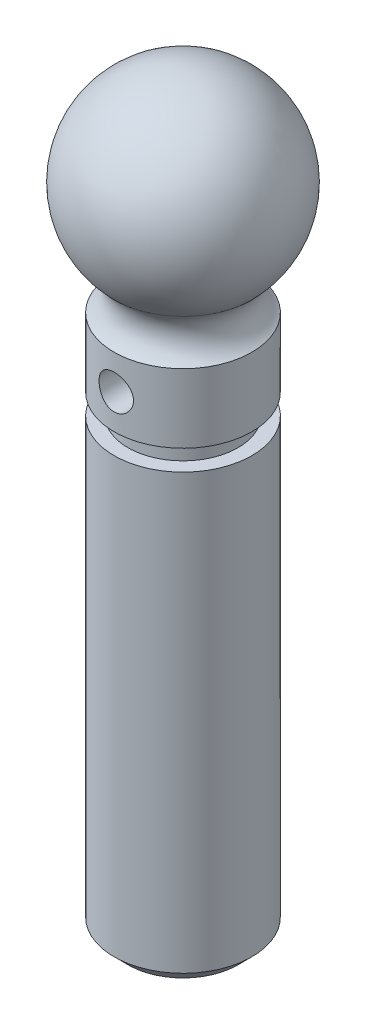
ISO-10303-21;
HEADER;
FILE_DESCRIPTION(('STEP AP214'),'2;1');
FILE_NAME('part.step','',(''),(''),'','','');
FILE_SCHEMA(('AUTOMOTIVE_DESIGN { 1 0 10303 214 1 1 1 1 }'));
ENDSEC;
DATA;
#1=APPLICATION_CONTEXT('core data for automotive mechanical design processes');
#2=APPLICATION_PROTOCOL_DEFINITION('international standard','automotive_design',2000,#1);
#3=PRODUCT_CONTEXT('',#1,'mechanical');
#4=PRODUCT('Part','Part','',(#3));
#5=PRODUCT_RELATED_PRODUCT_CATEGORY('part','',(#4));
#6=PRODUCT_DEFINITION_FORMATION('','',#4);
#7=PRODUCT_DEFINITION_CONTEXT('part definition',#1,'design');
#8=PRODUCT_DEFINITION('design','',#6,#7);
#9=PRODUCT_DEFINITION_SHAPE('','',#8);
#10=(LENGTH_UNIT() NAMED_UNIT(*) SI_UNIT(.MILLI.,.METRE.));
#11=(NAMED_UNIT(*) PLANE_ANGLE_UNIT() SI_UNIT($,.RADIAN.));
#12=(NAMED_UNIT(*) SI_UNIT($,.STERADIAN.) SOLID_ANGLE_UNIT());
#13=UNCERTAINTY_MEASURE_WITH_UNIT(LENGTH_MEASURE(1.E-05),#10,'distance_accuracy_value','');
#14=(GEOMETRIC_REPRESENTATION_CONTEXT(3) GLOBAL_UNCERTAINTY_ASSIGNED_CONTEXT((#13)) GLOBAL_UNIT_ASSIGNED_CONTEXT((#10,
#11,#12)) REPRESENTATION_CONTEXT('',''));
#15=CARTESIAN_POINT('',(0.,0.,0.));
#16=DIRECTION('',(0.,0.,1.));
#17=DIRECTION('',(1.,0.,0.));
#18=AXIS2_PLACEMENT_3D('',#15,#16,#17);
#19=CARTESIAN_POINT('',(0.,-152.629666453839,0.));
#20=DIRECTION('',(0.,-1.,0.));
#21=DIRECTION('',(0.,0.,-1.));
#22=AXIS2_PLACEMENT_3D('',#19,#20,#21);
#23=PLANE('',#22);
#24=CARTESIAN_POINT('',(0.,-152.629666453839,0.));
#25=DIRECTION('',(0.,-1.,0.));
#26=DIRECTION('',(0.,0.,-1.));
#27=AXIS2_PLACEMENT_3D('',#24,#25,#26);
#28=CIRCLE('',#27,80.);
#29=CARTESIAN_POINT('',(0.,-152.629666453839,-80.));
#30=VERTEX_POINT('',#29);
#31=EDGE_CURVE('E10',#30,#30,#28,.T.);
#32=ORIENTED_EDGE('',*,*,#31,.T.);
#33=EDGE_LOOP('',(#32));
#34=FACE_BOUND('',#33,.T.);
#35=ADVANCED_FACE('F39',(#34),#23,.T.);
#36=CARTESIAN_POINT('',(0.,-152.629666453839,0.));
#37=DIRECTION('',(0.,1.,0.));
#38=DIRECTION('',(0.,0.,1.));
#39=AXIS2_PLACEMENT_3D('',#36,#37,#38);
#40=CONICAL_SURFACE('',#39,80.,0.785398163397447);
#41=CARTESIAN_POINT('',(0.,-132.629666453839,0.));
#42=DIRECTION('',(0.,-1.,0.));
#43=DIRECTION('',(0.,0.,-1.));
#44=AXIS2_PLACEMENT_3D('',#41,#42,#43);
#45=CIRCLE('',#44,100.);
#46=CARTESIAN_POINT('',(0.,-132.629666453839,-100.));
#47=VERTEX_POINT('',#46);
#48=EDGE_CURVE('E52',#47,#47,#45,.T.);
#49=ORIENTED_EDGE('',*,*,#48,.T.);
#50=EDGE_LOOP('',(#49));
#51=FACE_BOUND('',#50,.T.);
#52=ORIENTED_EDGE('',*,*,#31,.F.);
#53=EDGE_LOOP('',(#52));
#54=FACE_BOUND('',#53,.T.);
#55=ADVANCED_FACE('F91',(#51,#54),#40,.T.);
#56=CARTESIAN_POINT('',(0.,-208.82897467915,0.));
#57=DIRECTION('',(0.,-1.,0.));
#58=DIRECTION('',(0.,0.,-1.));
#59=AXIS2_PLACEMENT_3D('',#56,#57,#58);
#60=CYLINDRICAL_SURFACE('',#59,100.);
#61=CARTESIAN_POINT('',(0.,497.370333546161,0.));
#62=DIRECTION('',(0.,-1.,0.));
#63=DIRECTION('',(0.,0.,-1.));
#64=AXIS2_PLACEMENT_3D('',#61,#62,#63);
#65=CIRCLE('',#64,100.);
#66=CARTESIAN_POINT('',(0.,497.370333546161,-100.));
#67=VERTEX_POINT('',#66);
#68=EDGE_CURVE('E58',#67,#67,#65,.T.);
#69=ORIENTED_EDGE('',*,*,#68,.T.);
#70=EDGE_LOOP('',(#69));
#71=FACE_BOUND('',#70,.T.);
#72=ORIENTED_EDGE('',*,*,#48,.F.);
#73=EDGE_LOOP('',(#72));
#74=FACE_BOUND('',#73,.T.);
#75=ADVANCED_FACE('F95',(#71,#74),#60,.T.);
#76=CARTESIAN_POINT('',(0.,497.370333546161,0.));
#77=DIRECTION('',(0.,1.,0.));
#78=DIRECTION('',(0.,0.,1.));
#79=AXIS2_PLACEMENT_3D('',#76,#77,#78);
#80=PLANE('',#79);
#81=CARTESIAN_POINT('',(0.,497.370333546161,0.));
#82=DIRECTION('',(0.,-1.,0.));
#83=DIRECTION('',(0.,0.,-1.));
#84=AXIS2_PLACEMENT_3D('',#81,#82,#83);
#85=CIRCLE('',#84,80.);
#86=CARTESIAN_POINT('',(0.,497.370333546161,-80.));
#87=VERTEX_POINT('',#86);
#88=EDGE_CURVE('E128',#87,#87,#85,.T.);
#89=ORIENTED_EDGE('',*,*,#88,.T.);
#90=EDGE_LOOP('',(#89));
#91=FACE_BOUND('',#90,.T.);
#92=ORIENTED_EDGE('',*,*,#68,.F.);
#93=EDGE_LOOP('',(#92));
#94=FACE_BOUND('',#93,.T.);
#95=ADVANCED_FACE('F100',(#91,#94),#80,.T.);
#96=CARTESIAN_POINT('',(0.,-208.82897467915,0.));
#97=DIRECTION('',(0.,-1.,0.));
#98=DIRECTION('',(0.,0.,-1.));
#99=AXIS2_PLACEMENT_3D('',#96,#97,#98);
#100=CYLINDRICAL_SURFACE('',#99,80.);
#101=CARTESIAN_POINT('',(0.,527.370333546161,0.));
#102=DIRECTION('',(0.,-1.,0.));
#103=DIRECTION('',(0.,0.,-1.));
#104=AXIS2_PLACEMENT_3D('',#101,#102,#103);
#105=CIRCLE('',#104,80.);
#106=CARTESIAN_POINT('',(0.,527.370333546161,-80.));
#107=VERTEX_POINT('',#106);
#108=EDGE_CURVE('E118',#107,#107,#105,.T.);
#109=ORIENTED_EDGE('',*,*,#108,.T.);
#110=EDGE_LOOP('',(#109));
#111=FACE_BOUND('',#110,.T.);
#112=ORIENTED_EDGE('',*,*,#88,.F.);
#113=EDGE_LOOP('',(#112));
#114=FACE_BOUND('',#113,.T.);
#115=ADVANCED_FACE('F107',(#111,#114),#100,.T.);
#116=CARTESIAN_POINT('',(0.,527.370333546161,0.));
#117=DIRECTION('',(0.,1.,0.));
#118=DIRECTION('',(0.,0.,1.));
#119=AXIS2_PLACEMENT_3D('',#116,#117,#118);
#120=PLANE('',#119);
#121=ORIENTED_EDGE('',*,*,#108,.F.);
#122=EDGE_LOOP('',(#121));
#123=FACE_BOUND('',#122,.T.);
#124=CARTESIAN_POINT('',(0.,527.370333546161,0.));
#125=DIRECTION('',(0.,-1.,0.));
#126=DIRECTION('',(0.,0.,-1.));
#127=AXIS2_PLACEMENT_3D('',#124,#125,#126);
#128=CIRCLE('',#127,100.);
#129=CARTESIAN_POINT('',(0.,527.370333546161,-100.));
#130=VERTEX_POINT('',#129);
#131=EDGE_CURVE('E121',#130,#130,#128,.T.);
#132=ORIENTED_EDGE('',*,*,#131,.T.);
#133=EDGE_LOOP('',(#132));
#134=FACE_BOUND('',#133,.T.);
#135=ADVANCED_FACE('F86',(#123,#134),#120,.F.);
#136=CARTESIAN_POINT('',(0.,-208.82897467915,0.));
#137=DIRECTION('',(0.,-1.,0.));
#138=DIRECTION('',(0.,0.,-1.));
#139=AXIS2_PLACEMENT_3D('',#136,#137,#138);
#140=CYLINDRICAL_SURFACE('',#139,100.);
#141=CARTESIAN_POINT('',(0.,602.370333546161,-100.));
#142=CARTESIAN_POINT('',(0.690691718577893,602.37033063179,-99.9999983687946));
#143=CARTESIAN_POINT('',(1.38144196188158,602.341686088876,-99.9928263562298));
#144=CARTESIAN_POINT('',(2.75795370811009,602.227340433713,-99.9643325641892));
#145=CARTESIAN_POINT('',(3.44371463282091,602.141632811618,-99.9430091703019));
#146=CARTESIAN_POINT('',(4.80560043844885,601.913827202951,-99.8867904125939));
#147=CARTESIAN_POINT('',(5.48172025067541,601.771700610666,-99.8518881641608));
#148=CARTESIAN_POINT('',(6.81913918226601,601.432239763702,-99.7694755652982));
#149=CARTESIAN_POINT('',(7.4804386800074,601.234906920232,-99.7219655371565));
#150=CARTESIAN_POINT('',(8.7828632093722,600.78688761564,-99.6157002768425));
#151=CARTESIAN_POINT('',(9.42401178688588,600.536266299872,-99.5569587839334));
#152=CARTESIAN_POINT('',(10.6826681805201,599.983450811957,-99.4297780119914));
#153=CARTESIAN_POINT('',(11.3001758714244,599.681256366693,-99.361338681602));
#154=CARTESIAN_POINT('',(12.50751204788,599.027512753588,-99.2165905956057));
#155=CARTESIAN_POINT('',(13.0973405154809,598.675963553741,-99.1402818348955));
#156=CARTESIAN_POINT('',(14.2455581957605,597.92597310924,-98.9818166046016));
#157=CARTESIAN_POINT('',(14.8039469737492,597.527531216477,-98.899660054201));
#158=CARTESIAN_POINT('',(15.8957836878018,596.678648637567,-98.7301115930059));
#159=CARTESIAN_POINT('',(16.4285793662583,596.227382550093,-98.642650958478));
#160=CARTESIAN_POINT('',(17.4544579588291,595.282018292891,-98.4663031294358));
#161=CARTESIAN_POINT('',(17.9475404035237,594.787919617014,-98.377415918074));
#162=CARTESIAN_POINT('',(18.8908144242953,593.76007824223,-98.2006490181519));
#163=CARTESIAN_POINT('',(19.3410013589341,593.226331264338,-98.1127694395238));
#164=CARTESIAN_POINT('',(20.1954102433873,592.122703272391,-97.9404686301785));
#165=CARTESIAN_POINT('',(20.5996319325418,591.552822053455,-97.8560474190748));
#166=CARTESIAN_POINT('',(21.3649693563398,590.371890841129,-97.6918297726577));
#167=CARTESIAN_POINT('',(21.7253533764776,589.760354086315,-97.6121209493078));
#168=CARTESIAN_POINT('',(22.3931998389296,588.508025648318,-97.4610788045016));
#169=CARTESIAN_POINT('',(22.7006616131715,587.867233595956,-97.3897455887797));
#170=CARTESIAN_POINT('',(23.2602118051115,586.56094513801,-97.2576230412988));
#171=CARTESIAN_POINT('',(23.5123071109714,585.895451817577,-97.1968323981329));
#172=CARTESIAN_POINT('',(23.9590871683512,584.5444740209,-97.0876670484091));
#173=CARTESIAN_POINT('',(24.1537732950483,583.858990023944,-97.0392920444512));
#174=CARTESIAN_POINT('',(24.480750686621,582.486989655108,-96.9573138223671));
#175=CARTESIAN_POINT('',(24.6142135564042,581.800768949308,-96.9234341466123));
#176=CARTESIAN_POINT('',(24.8232510194518,580.419008806161,-96.870108305993));
#177=CARTESIAN_POINT('',(24.8988263145035,579.723469481889,-96.8506619661492));
#178=CARTESIAN_POINT('',(24.9914162325889,578.328345236368,-96.8268114234769));
#179=CARTESIAN_POINT('',(25.0084391701139,577.628760903648,-96.8224050849543));
#180=CARTESIAN_POINT('',(24.9837950102734,576.230701528122,-96.8287671854087));
#181=CARTESIAN_POINT('',(24.9421287289765,575.532226470027,-96.8395354133845));
#182=CARTESIAN_POINT('',(24.802202268535,574.158507963292,-96.8754653985753));
#183=CARTESIAN_POINT('',(24.7053405668353,573.483112181275,-96.9002713800197));
#184=CARTESIAN_POINT('',(24.4569100969496,572.143109800594,-96.9632711174988));
#185=CARTESIAN_POINT('',(24.3053423464993,571.478503001456,-97.0014646244755));
#186=CARTESIAN_POINT('',(23.9487164736509,570.164614419876,-97.0901266600956));
#187=CARTESIAN_POINT('',(23.7436557403212,569.515333387155,-97.1405957878898));
#188=CARTESIAN_POINT('',(23.2816402498254,568.236468615357,-97.2523607127204));
#189=CARTESIAN_POINT('',(23.0246846753548,567.606885186684,-97.3136566802694));
#190=CARTESIAN_POINT('',(22.4579463407742,566.365288394409,-97.4460164642436));
#191=CARTESIAN_POINT('',(22.1476574104599,565.753515967376,-97.5171724732175));
#192=CARTESIAN_POINT('',(21.4783236807046,564.558197528169,-97.6667760825988));
#193=CARTESIAN_POINT('',(21.1192787012251,563.974651620236,-97.7452237099312));
#194=CARTESIAN_POINT('',(20.3548482641723,562.839383156844,-97.9072661620095));
#195=CARTESIAN_POINT('',(19.9494560332643,562.287665270605,-97.9908617382673));
#196=CARTESIAN_POINT('',(19.0950487034994,561.219579821211,-98.1609331805174));
#197=CARTESIAN_POINT('',(18.6460327697884,560.703212934912,-98.2474091016118));
#198=CARTESIAN_POINT('',(17.6938422098701,559.694858653353,-98.4234165639801));
#199=CARTESIAN_POINT('',(17.1894875790101,559.20398774641,-98.5129648717742));
#200=CARTESIAN_POINT('',(16.1410084351566,558.266342139896,-98.6901741383605));
#201=CARTESIAN_POINT('',(15.5968831454468,557.819568301935,-98.7778350602491));
#202=CARTESIAN_POINT('',(14.472432124181,556.973179204776,-98.9488355726236));
#203=CARTESIAN_POINT('',(13.8921049769188,556.573565791598,-99.0321749938797));
#204=CARTESIAN_POINT('',(12.6991288854059,555.824377230592,-99.1922086769535));
#205=CARTESIAN_POINT('',(12.0864801382907,555.474801777623,-99.2689029792935));
#206=CARTESIAN_POINT('',(10.8308247011352,554.8271755865,-99.4137513798676));
#207=CARTESIAN_POINT('',(10.1877201028004,554.529307730678,-99.4818749399064));
#208=CARTESIAN_POINT('',(8.87762384412271,553.988933417246,-99.607332854455));
#209=CARTESIAN_POINT('',(8.21063204960423,553.746427270662,-99.6646671483496));
#210=CARTESIAN_POINT('',(6.8576710589653,553.318813851282,-99.7668906400155));
#211=CARTESIAN_POINT('',(6.17170483459301,553.133697644978,-99.8117817746149));
#212=CARTESIAN_POINT('',(4.78578117187119,552.822407335752,-99.8878263883026));
#213=CARTESIAN_POINT('',(4.08582407890433,552.696231779672,-99.9189802060777));
#214=CARTESIAN_POINT('',(2.69526184748653,552.506397364823,-99.966029730172));
#215=CARTESIAN_POINT('',(2.00487612348988,552.441220556101,-99.9822956790733));
#216=CARTESIAN_POINT('',(0.62089245558632,552.36844074453,-100.000466926533));
#217=CARTESIAN_POINT('',(-0.0727054333184448,552.360836759479,-100.002372470084));
#218=CARTESIAN_POINT('',(-1.45796442161552,552.403265326862,-99.9917700686444));
#219=CARTESIAN_POINT('',(-2.14962567682487,552.453293100525,-99.9792633187093));
#220=CARTESIAN_POINT('',(-3.52600893426171,552.610546680047,-99.940188390627));
#221=CARTESIAN_POINT('',(-4.21073096361024,552.717772262267,-99.9136202674584));
#222=CARTESIAN_POINT('',(-5.55819500352659,552.986498241231,-99.8476577254419));
#223=CARTESIAN_POINT('',(-6.22111242833486,553.147168746012,-99.808459698821));
#224=CARTESIAN_POINT('',(-7.53085245831729,553.521849094841,-99.7181888014641));
#225=CARTESIAN_POINT('',(-8.17767527117616,553.735858250214,-99.6671160840471));
#226=CARTESIAN_POINT('',(-9.45094991369454,554.215583863445,-99.5544479454933));
#227=CARTESIAN_POINT('',(-10.0774002380307,554.481304132151,-99.49285174887));
#228=CARTESIAN_POINT('',(-11.3058115834774,555.062479746863,-99.3607583571575));
#229=CARTESIAN_POINT('',(-11.9077721522074,555.37793601108,-99.2902609977426));
#230=CARTESIAN_POINT('',(-13.0938146627452,556.06237540728,-99.1408876869046));
#231=CARTESIAN_POINT('',(-13.6773900720096,556.432208747556,-99.0618852966785));
#232=CARTESIAN_POINT('',(-14.8114641777587,557.218493833515,-98.8986794214972));
#233=CARTESIAN_POINT('',(-15.3619625531209,557.634946031676,-98.8144758860636));
#234=CARTESIAN_POINT('',(-16.4264679436742,558.511735952044,-98.6431035755755));
#235=CARTESIAN_POINT('',(-16.9404694556796,558.972080268119,-98.5559343562586));
#236=CARTESIAN_POINT('',(-17.9286314107784,559.933606640516,-98.3809738269668));
#237=CARTESIAN_POINT('',(-18.4027912765831,560.434789288362,-98.2931825079978));
#238=CARTESIAN_POINT('',(-19.3193533877432,561.487588879246,-98.1172040120614));
#239=CARTESIAN_POINT('',(-19.7606886014806,562.040142672565,-98.0290601430093));
#240=CARTESIAN_POINT('',(-20.5952724266509,563.181100145286,-97.8571221402337));
#241=CARTESIAN_POINT('',(-20.9885201605534,563.769504478618,-97.7733280859044));
#242=CARTESIAN_POINT('',(-21.7240809911119,564.978207743975,-97.6125304168433));
#243=CARTESIAN_POINT('',(-22.0663952807536,565.598505928511,-97.5355266430837));
#244=CARTESIAN_POINT('',(-22.6975093780628,566.866774754211,-97.3905948483771));
#245=CARTESIAN_POINT('',(-22.9863099302,567.514745010253,-97.3226667011759));
#246=CARTESIAN_POINT('',(-23.5065409880998,568.82986729559,-97.1983214090437));
#247=CARTESIAN_POINT('',(-23.7383053115312,569.496880910212,-97.1418376446611));
#248=CARTESIAN_POINT('',(-24.144787808294,570.849016532051,-97.041604989601));
#249=CARTESIAN_POINT('',(-24.319506061575,571.534138513887,-96.9978560810756));
#250=CARTESIAN_POINT('',(-24.610365149996,572.917325342148,-96.9244678097152));
#251=CARTESIAN_POINT('',(-24.7265167337435,573.615387789239,-96.8948258579186));
#252=CARTESIAN_POINT('',(-24.899254408564,575.01931185043,-96.8505814129701));
#253=CARTESIAN_POINT('',(-24.9558419327214,575.725173276477,-96.8359785579845));
#254=CARTESIAN_POINT('',(-25.0081805511487,577.118952419221,-96.8224745496354));
#255=CARTESIAN_POINT('',(-25.0056340517487,577.806802527029,-96.8231340084288));
#256=CARTESIAN_POINT('',(-24.9438993060863,579.179775813599,-96.8390567190163));
#257=CARTESIAN_POINT('',(-24.8847122059515,579.864899047259,-96.8543196753074));
#258=CARTESIAN_POINT('',(-24.7102062085561,581.227466043072,-96.8989875673301));
#259=CARTESIAN_POINT('',(-24.5948888038426,581.904910008934,-96.9283921270255));
#260=CARTESIAN_POINT('',(-24.3090887740212,583.247336073335,-97.0004633253883));
#261=CARTESIAN_POINT('',(-24.138605872371,583.912318109385,-97.0431300305382));
#262=CARTESIAN_POINT('',(-23.7450417831308,585.221274461342,-97.1401758671174));
#263=CARTESIAN_POINT('',(-23.5222816522771,585.865350724285,-97.1944833379541));
#264=CARTESIAN_POINT('',(-23.0253369606671,587.132347930254,-97.3134064801047));
#265=CARTESIAN_POINT('',(-22.7511527683428,587.755269024811,-97.3780220775648));
#266=CARTESIAN_POINT('',(-22.1533369241106,588.976005277578,-97.5157613159781));
#267=CARTESIAN_POINT('',(-21.829700000846,589.573817750692,-97.5888858637346));
#268=CARTESIAN_POINT('',(-21.1352574183011,590.740516148953,-97.7416351358587));
#269=CARTESIAN_POINT('',(-20.7644507533768,591.309401457019,-97.821259998798));
#270=CARTESIAN_POINT('',(-19.9678759257203,592.42915996954,-97.9870076257221));
#271=CARTESIAN_POINT('',(-19.5409260434664,592.979175766693,-98.0732457319405));
#272=CARTESIAN_POINT('',(-18.642849663515,594.041504844209,-98.2479178566054));
#273=CARTESIAN_POINT('',(-18.1717223773881,594.553817451396,-98.336351914222));
#274=CARTESIAN_POINT('',(-17.1882735265502,595.537531242494,-98.5130084852273));
#275=CARTESIAN_POINT('',(-16.6759425070319,596.008922984609,-98.6012309452514));
#276=CARTESIAN_POINT('',(-15.6134987319544,596.907547759686,-98.7750391189996));
#277=CARTESIAN_POINT('',(-15.0633860059623,597.334780827205,-98.860624834787));
#278=CARTESIAN_POINT('',(-13.9186287608454,598.149511272594,-99.0283413187066));
#279=CARTESIAN_POINT('',(-13.323357520361,598.536147407116,-99.110381268769));
#280=CARTESIAN_POINT('',(-12.1013263586289,599.257805850757,-99.2670001275186));
#281=CARTESIAN_POINT('',(-11.4745649569063,599.592825730178,-99.3415786849227));
#282=CARTESIAN_POINT('',(-10.1943329896488,600.208454562156,-99.481103275592));
#283=CARTESIAN_POINT('',(-9.54087977494462,600.489098200962,-99.5460554432101));
#284=CARTESIAN_POINT('',(-8.21157839812749,600.993950397421,-99.6645121200838));
#285=CARTESIAN_POINT('',(-7.53573363177976,601.218167468449,-99.7180183560647));
#286=CARTESIAN_POINT('',(-6.29582951428942,601.571493718252,-99.8031697372876));
#287=CARTESIAN_POINT('',(-5.73473732965821,601.710565596903,-99.8370347879853));
#288=CARTESIAN_POINT('',(-4.60363901814699,601.949606546901,-99.8955814129244));
#289=CARTESIAN_POINT('',(-4.03363073252669,602.049565991151,-99.9202607261246));
#290=CARTESIAN_POINT('',(-2.88775475124441,602.209728131675,-99.9599394513684));
#291=CARTESIAN_POINT('',(-2.31188740827094,602.269933206771,-99.9749394426022));
#292=CARTESIAN_POINT('',(-1.15735989370907,602.350231909854,-99.9949691015044));
#293=CARTESIAN_POINT('',(-0.578700489132101,602.370335987986,-100.000001366716));
#294=CARTESIAN_POINT('',(0.,602.370333546161,-100.));
#295=B_SPLINE_CURVE_WITH_KNOTS('',3,(#141,#142,#143,#144,#145,#146,#147,#148,#149,#150,#151,
#152,#153,#154,#155,#156,#157,#158,#159,#160,#161,#162,#163,#164,#165,#166,#167,#168,#169,#170,
#171,#172,#173,#174,#175,#176,#177,#178,#179,#180,#181,#182,#183,#184,#185,#186,#187,#188,#189,
#190,#191,#192,#193,#194,#195,#196,#197,#198,#199,#200,#201,#202,#203,#204,#205,#206,#207,#208,
#209,#210,#211,#212,#213,#214,#215,#216,#217,#218,#219,#220,#221,#222,#223,#224,#225,#226,#227,
#228,#229,#230,#231,#232,#233,#234,#235,#236,#237,#238,#239,#240,#241,#242,#243,#244,#245,#246,
#247,#248,#249,#250,#251,#252,#253,#254,#255,#256,#257,#258,#259,#260,#261,#262,#263,#264,#265,
#266,#267,#268,#269,#270,#271,#272,#273,#274,#275,#276,#277,#278,#279,#280,#281,#282,#283,#284,
#285,#286,#287,#288,#289,#290,#291,#292,#293,#294),.UNSPECIFIED.,.T.,.F.,(4,2,2,2,2,2,2,2,2,2,2,
2,2,2,2,2,2,2,2,2,2,2,2,2,2,2,2,2,2,2,2,2,2,2,2,2,2,2,2,2,2,2,2,2,2,2,2,2,2,2,2,2,2,2,2,2,2,2,2,
2,2,2,2,2,2,2,2,2,2,2,2,2,2,2,2,2,4),(0.,2.07154772336505,4.1433318127346,6.21616768871231,
8.28895058270257,10.3592139133876,12.4294882079173,14.4997638450398,16.5700680990886,
18.6786613346413,20.7872794905936,22.8961255476291,25.0049835629279,27.1452518816709,
29.285547216444,31.4255761252987,33.5655537678246,35.6626698502671,37.7597605083855,
39.8565533653114,41.9533170667974,43.9991779786941,46.0450008319382,48.0909235581542,
50.13687850862,52.2034472600842,54.2700236428498,56.3369024286599,58.4038207774139,
60.5297328328953,62.6556864182894,64.7817231931958,66.9077470025134,69.0411434788409,
71.1745519404422,73.307628141698,75.4406517500885,77.5190618523894,79.5974364965344,
81.6756388161733,83.7538330102977,85.8011564249123,87.8484534071704,89.8959013220849,
91.9433870407815,94.0271911971411,96.1110155804636,98.1951535092679,100.279321631147,
102.414716830645,104.55015099236,106.685535129119,108.820889556721,110.943432087103,
113.065971642744,115.188121511612,117.310220321346,119.371303922137,121.432345817604,
123.493332911411,125.554330337018,127.602987062988,129.65162911175,131.700489685677,
133.749393947989,135.851764348232,137.954172276399,140.057064017271,142.159954112486,
144.300985029711,146.442116699489,148.581878025975,150.721316321548,152.457105282708,
154.193321220934,155.92943325805,157.665092812852),.UNSPECIFIED.);
#296=CARTESIAN_POINT('',(0.,602.370333546161,-100.));
#297=VERTEX_POINT('',#296);
#298=EDGE_CURVE('E42',#297,#297,#295,.T.);
#299=ORIENTED_EDGE('',*,*,#298,.F.);
#300=EDGE_LOOP('',(#299));
#301=FACE_BOUND('',#300,.T.);
#302=CARTESIAN_POINT('',(25.,577.370333546161,96.8245836551854));
#303=CARTESIAN_POINT('',(24.9999970616273,578.060645375375,96.8245854745999));
#304=CARTESIAN_POINT('',(24.9713837698994,578.751015917047,96.831986152206));
#305=CARTESIAN_POINT('',(24.8571657894974,580.126757510841,96.8613685320391));
#306=CARTESIAN_POINT('',(24.7715545662873,580.812127980619,96.8833519061003));
#307=CARTESIAN_POINT('',(24.5440123562521,582.173225838014,96.9412462724951));
#308=CARTESIAN_POINT('',(24.4020520792349,582.848948020918,96.9771645079383));
#309=CARTESIAN_POINT('',(24.0630015582853,584.185562079653,97.0618485176007));
#310=CARTESIAN_POINT('',(23.8659126950349,584.846454326449,97.1106139700627));
#311=CARTESIAN_POINT('',(23.4184823404702,586.148011918968,97.2194814509941));
#312=CARTESIAN_POINT('',(23.1682108291988,586.788702586794,97.2795685702615));
#313=CARTESIAN_POINT('',(22.6161798465929,588.046480435171,97.4093873837344));
#314=CARTESIAN_POINT('',(22.3144201031168,588.663567490945,97.4791191289162));
#315=CARTESIAN_POINT('',(21.6616135647911,589.870133515559,97.6262587137456));
#316=CARTESIAN_POINT('',(21.3105663561337,590.459612252549,97.7036666178391));
#317=CARTESIAN_POINT('',(20.561627092671,591.607222075345,97.8640183809547));
#318=CARTESIAN_POINT('',(20.1637343546382,592.165352703773,97.9469623207107));
#319=CARTESIAN_POINT('',(19.3154119355407,593.257511058082,98.1178154392342));
#320=CARTESIAN_POINT('',(18.8640961645914,593.790840412407,98.2057904966847));
#321=CARTESIAN_POINT('',(17.9185192820412,594.817793859914,98.382711712644));
#322=CARTESIAN_POINT('',(17.4242576343117,595.311417457267,98.471657883264));
#323=CARTESIAN_POINT('',(16.395981422222,596.255754087168,98.6480809319905));
#324=CARTESIAN_POINT('',(15.8619632635796,596.706463231517,98.7355576763718));
#325=CARTESIAN_POINT('',(14.7576838665687,597.561880362532,98.9066372356113));
#326=CARTESIAN_POINT('',(14.1874224684111,597.966588146365,98.9902400333874));
#327=CARTESIAN_POINT('',(13.0061645521339,598.732497886072,99.1524078021352));
#328=CARTESIAN_POINT('',(12.3947097272979,599.093011910717,99.2308859210377));
#329=CARTESIAN_POINT('',(11.1425307592606,599.761126029837,99.3792807630436));
#330=CARTESIAN_POINT('',(10.501806260338,600.068725481013,99.4491973820591));
#331=CARTESIAN_POINT('',(9.19565301719842,600.628552648606,99.5784642595474));
#332=CARTESIAN_POINT('',(8.5302270988342,600.880786676167,99.6378157222039));
#333=CARTESIAN_POINT('',(7.17940674093004,601.32784229174,99.7442481767985));
#334=CARTESIAN_POINT('',(6.49401276552392,601.522665213037,99.7913294536898));
#335=CARTESIAN_POINT('',(5.12237712983338,601.849881274347,99.8710347595305));
#336=CARTESIAN_POINT('',(4.43643387778207,601.983459086697,99.9039323240598));
#337=CARTESIAN_POINT('',(3.0552523601549,602.192768458733,99.9557050150334));
#338=CARTESIAN_POINT('',(2.36001420820846,602.26850072492,99.9745803127394));
#339=CARTESIAN_POINT('',(0.96548473066567,602.361454364079,99.9977704181674));
#340=CARTESIAN_POINT('',(0.266193938380401,602.378683268249,100.002087100034));
#341=CARTESIAN_POINT('',(-1.13130441985491,602.354499102414,99.9960418508521));
#342=CARTESIAN_POINT('',(-1.82951199914959,602.313086760675,99.9856801020947));
#343=CARTESIAN_POINT('',(-3.20417981210038,602.173556917598,99.9509653190368));
#344=CARTESIAN_POINT('',(-3.88077850177767,602.076720135672,99.9269283571732));
#345=CARTESIAN_POINT('',(-5.22319547538982,601.828137764832,99.8657583403713));
#346=CARTESIAN_POINT('',(-5.8890139460594,601.676393128097,99.8286255125337));
#347=CARTESIAN_POINT('',(-7.20529930600362,601.31921112578,99.742261544355));
#348=CARTESIAN_POINT('',(-7.85576568726136,601.113771986099,99.6930300042683));
#349=CARTESIAN_POINT('',(-9.136950549492,600.650799611248,99.583781478904));
#350=CARTESIAN_POINT('',(-9.7676687496275,600.393265635628,99.523764340327));
#351=CARTESIAN_POINT('',(-11.0108010674711,599.825475621687,99.3939453393901));
#352=CARTESIAN_POINT('',(-11.6229988555184,599.514765127021,99.3240601278314));
#353=CARTESIAN_POINT('',(-12.8190987470094,598.84452029267,99.1767808396332));
#354=CARTESIAN_POINT('',(-13.4030007587637,598.48498579479,99.0993867386643));
#355=CARTESIAN_POINT('',(-14.538887342836,597.719531689566,98.9391218641554));
#356=CARTESIAN_POINT('',(-15.0908672647017,597.313605349305,98.8562502964002));
#357=CARTESIAN_POINT('',(-16.1593684028108,596.458110546832,98.6872202885033));
#358=CARTESIAN_POINT('',(-16.6758889563233,596.008541269319,98.6010617869759));
#359=CARTESIAN_POINT('',(-17.6837185262898,595.055915768402,98.4253769536768));
#360=CARTESIAN_POINT('',(-18.1739655712883,594.551740544896,98.3358226147209));
#361=CARTESIAN_POINT('',(-19.110382278399,593.50374915575,98.1581401562259));
#362=CARTESIAN_POINT('',(-19.5565511163678,592.959932249249,98.0700120633793));
#363=CARTESIAN_POINT('',(-20.4017835894276,591.836208346914,97.8976676394506));
#364=CARTESIAN_POINT('',(-20.8008446790282,591.256299403413,97.8134515199027));
#365=CARTESIAN_POINT('',(-21.5490032693976,590.064254422025,97.6513544650869));
#366=CARTESIAN_POINT('',(-21.8981010019707,589.452118533673,97.5734735004277));
#367=CARTESIAN_POINT('',(-22.5453252558234,588.196666642154,97.4259671802193));
#368=CARTESIAN_POINT('',(-22.8431944824815,587.553212945724,97.3563840067806));
#369=CARTESIAN_POINT('',(-23.383524142368,586.242387502001,97.2280205203855));
#370=CARTESIAN_POINT('',(-23.6259842249195,585.575015603365,97.1692402757998));
#371=CARTESIAN_POINT('',(-24.0534494773383,584.221268442479,97.064308839212));
#372=CARTESIAN_POINT('',(-24.238464723512,583.534896536021,97.0181554325255));
#373=CARTESIAN_POINT('',(-24.5494931790464,582.148126961577,96.9399203563488));
#374=CARTESIAN_POINT('',(-24.6755079450297,581.447729664135,96.9078383156121));
#375=CARTESIAN_POINT('',(-24.8648767655923,580.056858977664,96.8594197290202));
#376=CARTESIAN_POINT('',(-24.929798594394,579.366612403186,96.8426895211187));
#377=CARTESIAN_POINT('',(-25.0020934148538,577.982916582304,96.8240504225183));
#378=CARTESIAN_POINT('',(-25.0094674154016,577.289467392258,96.8221412719866));
#379=CARTESIAN_POINT('',(-24.9666051028738,575.90453372134,96.8332025108535));
#380=CARTESIAN_POINT('',(-24.9163736828646,575.213049078598,96.8461716364753));
#381=CARTESIAN_POINT('',(-24.758746284817,573.837059500143,96.8865887738993));
#382=CARTESIAN_POINT('',(-24.6513505584268,573.152554533717,96.9140367219628));
#383=CARTESIAN_POINT('',(-24.3825405095912,571.806617038518,96.9820115459796));
#384=CARTESIAN_POINT('',(-24.2220410553026,571.144990225382,97.0223165261593));
#385=CARTESIAN_POINT('',(-23.8479198671635,569.837811592393,97.1149515521925));
#386=CARTESIAN_POINT('',(-23.634298873843,569.192259548591,97.1672814304148));
#387=CARTESIAN_POINT('',(-23.1555580146171,567.921459641064,97.2824788994668));
#388=CARTESIAN_POINT('',(-22.8904335612999,567.296213591787,97.3453474289056));
#389=CARTESIAN_POINT('',(-22.3106451785383,566.070111855563,97.4798626460721));
#390=CARTESIAN_POINT('',(-21.9959802496074,565.469256661013,97.5515095108976));
#391=CARTESIAN_POINT('',(-21.3126756973012,564.284203778701,97.7030944406044));
#392=CARTESIAN_POINT('',(-20.9430985443756,563.700563892552,97.7831675559273));
#393=CARTESIAN_POINT('',(-20.1573031736421,562.566308605125,97.9481712189899));
#394=CARTESIAN_POINT('',(-19.7410844583623,562.015693556181,98.0331018185341));
#395=CARTESIAN_POINT('',(-18.8647217778008,560.950900381053,98.205507341995));
#396=CARTESIAN_POINT('',(-18.4045715315129,560.436727483465,98.2929826284855));
#397=CARTESIAN_POINT('',(-17.4433750156431,559.448169235034,98.4681027729537));
#398=CARTESIAN_POINT('',(-16.9423281710377,558.973784443819,98.5557476332989));
#399=CARTESIAN_POINT('',(-15.8894879091463,558.056510731347,98.7310284649636));
#400=CARTESIAN_POINT('',(-15.3367375189785,557.614708845919,98.8186091854579));
#401=CARTESIAN_POINT('',(-14.1952896946732,556.77921898965,98.9890230450824));
#402=CARTESIAN_POINT('',(-13.6065915935112,556.385531912006,99.0718560960624));
#403=CARTESIAN_POINT('',(-12.3972299231807,555.649148872341,99.2304415884726));
#404=CARTESIAN_POINT('',(-11.7765673448106,555.306451331084,99.3061942491681));
#405=CARTESIAN_POINT('',(-10.5075243456159,554.674644075024,99.4484767840852));
#406=CARTESIAN_POINT('',(-9.85914433490471,554.385533567671,99.5150067947054));
#407=CARTESIAN_POINT('',(-8.54406167388931,553.865112706392,99.6364984287845));
#408=CARTESIAN_POINT('',(-7.87752787217641,553.633394775249,99.6915411623292));
#409=CARTESIAN_POINT('',(-6.52640254048846,553.226934090748,99.7891014791772));
#410=CARTESIAN_POINT('',(-5.84181104765957,553.052191220197,99.8316190882435));
#411=CARTESIAN_POINT('',(-4.45971186485633,552.761196919522,99.9029012780823));
#412=CARTESIAN_POINT('',(-3.76220627129401,552.644936080546,99.9316680711107));
#413=CARTESIAN_POINT('',(-2.35941539379705,552.471888474234,99.9746243465927));
#414=CARTESIAN_POINT('',(-1.65413028076515,552.415100403001,99.9888141486358));
#415=CARTESIAN_POINT('',(-0.26028226114374,552.362226237405,100.002024108609));
#416=CARTESIAN_POINT('',(0.428216622789021,552.364538901749,100.00144442382));
#417=CARTESIAN_POINT('',(1.80251179217935,552.425914469916,99.9861148160972));
#418=CARTESIAN_POINT('',(2.48830812943723,552.484976280651,99.9713651661013));
#419=CARTESIAN_POINT('',(3.85224171245556,552.659345908996,99.928103136776));
#420=CARTESIAN_POINT('',(4.53037922474077,552.774651763122,99.8995912378882));
#421=CARTESIAN_POINT('',(5.87421108956118,553.060550395395,99.829586651554));
#422=CARTESIAN_POINT('',(6.53990538633966,553.231143421216,99.7880939059565));
#423=CARTESIAN_POINT('',(7.85065995960653,553.62516669884,99.6935133693835));
#424=CARTESIAN_POINT('',(8.49581244785601,553.848305842314,99.6404895806046));
#425=CARTESIAN_POINT('',(9.76490943705731,554.346190234104,99.5241308624912));
#426=CARTESIAN_POINT('',(10.3888540793416,554.620935138432,99.4607960018876));
#427=CARTESIAN_POINT('',(11.6115387919193,555.220035813238,99.3254779556776));
#428=CARTESIAN_POINT('',(12.210276450788,555.5443963165,99.2534939451779));
#429=CARTESIAN_POINT('',(13.3786960875797,556.240427349908,99.1027625340027));
#430=CARTESIAN_POINT('',(13.9483774878634,556.612098820084,99.0240149989516));
#431=CARTESIAN_POINT('',(15.0684073645087,557.409697201394,98.8598559405067));
#432=CARTESIAN_POINT('',(15.6179654449935,557.836710808963,98.7743299470709));
#433=CARTESIAN_POINT('',(16.6793555430007,558.73481878984,98.6006508813093));
#434=CARTESIAN_POINT('',(17.1911869299677,559.205913899619,98.5124977651089));
#435=CARTESIAN_POINT('',(18.1739343746595,560.189199085611,98.3359418912802));
#436=CARTESIAN_POINT('',(18.64484039227,560.70139918706,98.2475390778556));
#437=CARTESIAN_POINT('',(19.5425034931476,561.763475630294,98.0729304788871));
#438=CARTESIAN_POINT('',(19.9692605626863,562.313351983796,97.9867246940262));
#439=CARTESIAN_POINT('',(20.7832856777897,563.457845954041,97.8173356227588));
#440=CARTESIAN_POINT('',(21.1696670449502,564.053107510334,97.7342388898433));
#441=CARTESIAN_POINT('',(21.8908221046559,565.275076936718,97.5752444288314));
#442=CARTESIAN_POINT('',(22.2255933374987,565.901786303704,97.4993470439171));
#443=CARTESIAN_POINT('',(22.8407435895093,567.181889396301,97.3570751647258));
#444=CARTESIAN_POINT('',(23.1211577831297,567.835265532193,97.2906945194564));
#445=CARTESIAN_POINT('',(23.6255792275895,569.164415711066,97.1694365584913));
#446=CARTESIAN_POINT('',(23.8495950779609,569.840186321568,97.1145574892672));
#447=CARTESIAN_POINT('',(24.2024634333927,571.079563501081,97.0271463645441));
#448=CARTESIAN_POINT('',(24.341302539482,571.640191356226,96.9923506323394));
#449=CARTESIAN_POINT('',(24.5799483729587,572.770363967455,96.932148101566));
#450=CARTESIAN_POINT('',(24.6797455234492,573.339910875773,96.9067436067291));
#451=CARTESIAN_POINT('',(24.8396492221084,574.484865526601,96.8658797029266));
#452=CARTESIAN_POINT('',(24.8997584865289,575.060272865284,96.8504196133646));
#453=CARTESIAN_POINT('',(24.9799298860679,576.213884764868,96.8297721665042));
#454=CARTESIAN_POINT('',(25.0000024613504,576.792088557119,96.8245821311389));
#455=CARTESIAN_POINT('',(25.,577.370333546161,96.8245836551854));
#456=B_SPLINE_CURVE_WITH_KNOTS('',3,(#302,#303,#304,#305,#306,#307,#308,#309,#310,#311,#312,
#313,#314,#315,#316,#317,#318,#319,#320,#321,#322,#323,#324,#325,#326,#327,#328,#329,#330,#331,
#332,#333,#334,#335,#336,#337,#338,#339,#340,#341,#342,#343,#344,#345,#346,#347,#348,#349,#350,
#351,#352,#353,#354,#355,#356,#357,#358,#359,#360,#361,#362,#363,#364,#365,#366,#367,#368,#369,
#370,#371,#372,#373,#374,#375,#376,#377,#378,#379,#380,#381,#382,#383,#384,#385,#386,#387,#388,
#389,#390,#391,#392,#393,#394,#395,#396,#397,#398,#399,#400,#401,#402,#403,#404,#405,#406,#407,
#408,#409,#410,#411,#412,#413,#414,#415,#416,#417,#418,#419,#420,#421,#422,#423,#424,#425,#426,
#427,#428,#429,#430,#431,#432,#433,#434,#435,#436,#437,#438,#439,#440,#441,#442,#443,#444,#445,
#446,#447,#448,#449,#450,#451,#452,#453,#454,#455),.UNSPECIFIED.,.T.,.F.,(4,2,2,2,2,2,2,2,2,2,2,
2,2,2,2,2,2,2,2,2,2,2,2,2,2,2,2,2,2,2,2,2,2,2,2,2,2,2,2,2,2,2,2,2,2,2,2,2,2,2,2,2,2,2,2,2,2,2,2,
2,2,2,2,2,2,2,2,2,2,2,2,2,2,2,2,2,4),(0.,2.07040706344222,4.14105152988498,6.21277372807051,
8.28444404512602,10.3534050638423,12.4223770184174,14.4913663447095,16.5603858503014,
18.6704759706873,20.7805924368374,22.8908999053064,25.001216678339,27.1410596792203,
29.2809286930341,31.420553654832,33.560128923199,35.656363714784,37.7525729034544,
39.8485122347529,41.9444255367835,43.9937574668265,46.0430538603285,48.0924179724098,
50.1418112151201,52.2096838638524,54.2775632128476,56.3457430582902,58.4139615472234,
60.5382054685262,62.6624890999343,64.7868874655621,66.9112759747524,69.0460409364614,
71.1808194084326,73.3152232105152,75.4495706969782,77.5275196292472,79.6054321322403,
81.6831681481856,83.7608950176167,85.8045443489654,87.8481651928391,89.8919681454907,
91.9358123374504,94.0197407741037,96.1036914397503,98.1879405007547,100.272218872228,
102.408722998688,104.545266780915,106.681744376815,108.818190371851,110.938998725726,
113.059802717265,115.180265395137,117.300681582484,119.363710900235,121.426700481213,
123.489618048196,125.552544856678,127.604301196295,129.656043860001,131.707982359613,
133.759961635945,135.861112294048,137.962298062348,140.063997862479,142.165698316144,
144.306662697245,146.447729083666,148.587405326294,150.726755116536,152.461193424626,
154.196056919852,155.930801668147,157.665093996696),.UNSPECIFIED.);
#457=CARTESIAN_POINT('',(25.,577.370333546161,96.8245836551854));
#458=VERTEX_POINT('',#457);
#459=EDGE_CURVE('E61',#458,#458,#456,.T.);
#460=ORIENTED_EDGE('',*,*,#459,.F.);
#461=EDGE_LOOP('',(#460));
#462=FACE_BOUND('',#461,.T.);
#463=CARTESIAN_POINT('',(0.,627.370333546161,0.));
#464=DIRECTION('',(0.,-1.,0.));
#465=DIRECTION('',(0.,0.,-1.));
#466=AXIS2_PLACEMENT_3D('',#463,#464,#465);
#467=CIRCLE('',#466,100.);
#468=CARTESIAN_POINT('',(0.,627.370333546161,-100.));
#469=VERTEX_POINT('',#468);
#470=EDGE_CURVE('E124',#469,#469,#467,.T.);
#471=ORIENTED_EDGE('',*,*,#470,.T.);
#472=EDGE_LOOP('',(#471));
#473=FACE_BOUND('',#472,.T.);
#474=ORIENTED_EDGE('',*,*,#131,.F.);
#475=EDGE_LOOP('',(#474));
#476=FACE_BOUND('',#475,.T.);
#477=ADVANCED_FACE('F67',(#301,#462,#473,#476),#140,.T.);
#478=CARTESIAN_POINT('',(0.,660.253618057636,0.));
#479=DIRECTION('',(0.,-1.,0.));
#480=DIRECTION('',(0.,0.,-1.));
#481=AXIS2_PLACEMENT_3D('',#478,#479,#480);
#482=TOROIDAL_SURFACE('',#481,122.774757951236,40.);
#483=ORIENTED_EDGE('',*,*,#470,.F.);
#484=EDGE_LOOP('',(#483));
#485=FACE_BOUND('',#484,.T.);
#486=CARTESIAN_POINT('',(0.,693.136902569111,0.));
#487=DIRECTION('',(0.,-1.,0.));
#488=DIRECTION('',(0.,0.,-1.));
#489=AXIS2_PLACEMENT_3D('',#486,#487,#488);
#490=CIRCLE('',#489,100.);
#491=CARTESIAN_POINT('',(0.,693.136902569111,-100.));
#492=VERTEX_POINT('',#491);
#493=EDGE_CURVE('E131',#492,#492,#490,.T.);
#494=ORIENTED_EDGE('',*,*,#493,.T.);
#495=EDGE_LOOP('',(#494));
#496=FACE_BOUND('',#495,.T.);
#497=ADVANCED_FACE('F79',(#485,#496),#482,.F.);
#498=CARTESIAN_POINT('',(0.,791.116492280438,0.));
#499=DIRECTION('',(0.,-1.,0.));
#500=DIRECTION('',(1.,0.,0.));
#501=AXIS2_PLACEMENT_3D('',#498,#499,#500);
#502=SPHERICAL_SURFACE('',#501,140.);
#503=ORIENTED_EDGE('',*,*,#493,.F.);
#504=EDGE_LOOP('',(#503));
#505=FACE_BOUND('',#504,.T.);
#506=ADVANCED_FACE('F75',(#505),#502,.T.);
#507=CARTESIAN_POINT('',(0.,577.370333546161,-140.));
#508=DIRECTION('',(0.,0.,1.));
#509=DIRECTION('',(1.,0.,0.));
#510=AXIS2_PLACEMENT_3D('',#507,#508,#509);
#511=CYLINDRICAL_SURFACE('',#510,25.);
#512=ORIENTED_EDGE('',*,*,#298,.T.);
#513=EDGE_LOOP('',(#512));
#514=FACE_BOUND('',#513,.T.);
#515=ORIENTED_EDGE('',*,*,#459,.T.);
#516=EDGE_LOOP('',(#515));
#517=FACE_BOUND('',#516,.T.);
#518=ADVANCED_FACE('F71',(#514,#517),#511,.F.);
#519=CLOSED_SHELL('',(#35,#55,#75,#95,#115,#135,#477,#497,#506,#518));
#520=MANIFOLD_SOLID_BREP('B2',#519);
#521=ADVANCED_BREP_SHAPE_REPRESENTATION('',(#18,#520),#14);
#522=SHAPE_DEFINITION_REPRESENTATION(#9,#521);
ENDSEC;
END-ISO-10303-21;
